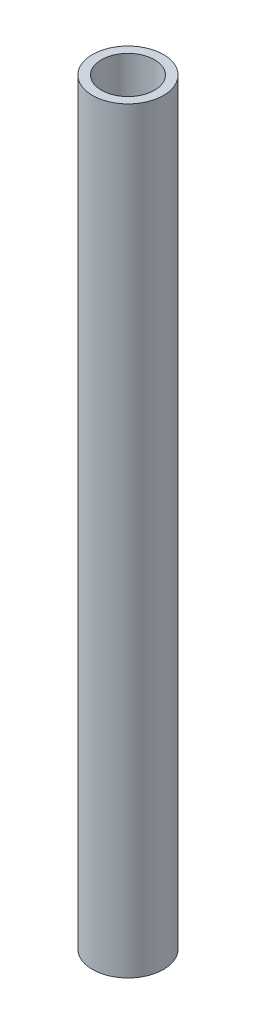
ISO-10303-21;
HEADER;
FILE_DESCRIPTION(('STEP AP214'),'2;1');
FILE_NAME('part.step','',(''),(''),'','','');
FILE_SCHEMA(('AUTOMOTIVE_DESIGN { 1 0 10303 214 1 1 1 1 }'));
ENDSEC;
DATA;
#1=APPLICATION_CONTEXT('core data for automotive mechanical design processes');
#2=APPLICATION_PROTOCOL_DEFINITION('international standard','automotive_design',2000,#1);
#3=PRODUCT_CONTEXT('',#1,'mechanical');
#4=PRODUCT('Part','Part','',(#3));
#5=PRODUCT_RELATED_PRODUCT_CATEGORY('part','',(#4));
#6=PRODUCT_DEFINITION_FORMATION('','',#4);
#7=PRODUCT_DEFINITION_CONTEXT('part definition',#1,'design');
#8=PRODUCT_DEFINITION('design','',#6,#7);
#9=PRODUCT_DEFINITION_SHAPE('','',#8);
#10=(LENGTH_UNIT() NAMED_UNIT(*) SI_UNIT(.MILLI.,.METRE.));
#11=(NAMED_UNIT(*) PLANE_ANGLE_UNIT() SI_UNIT($,.RADIAN.));
#12=(NAMED_UNIT(*) SI_UNIT($,.STERADIAN.) SOLID_ANGLE_UNIT());
#13=UNCERTAINTY_MEASURE_WITH_UNIT(LENGTH_MEASURE(1.E-05),#10,'distance_accuracy_value','');
#14=(GEOMETRIC_REPRESENTATION_CONTEXT(3) GLOBAL_UNCERTAINTY_ASSIGNED_CONTEXT((#13)) GLOBAL_UNIT_ASSIGNED_CONTEXT((#10,
#11,#12)) REPRESENTATION_CONTEXT('',''));
#15=CARTESIAN_POINT('',(0.,0.,0.));
#16=DIRECTION('',(0.,0.,1.));
#17=DIRECTION('',(1.,0.,0.));
#18=AXIS2_PLACEMENT_3D('',#15,#16,#17);
#19=CARTESIAN_POINT('',(0.,203.2,0.));
#20=DIRECTION('',(0.,1.,0.));
#21=DIRECTION('',(0.,0.,1.));
#22=AXIS2_PLACEMENT_3D('',#19,#20,#21);
#23=PLANE('',#22);
#24=CARTESIAN_POINT('',(0.,203.2,0.));
#25=DIRECTION('',(0.,1.,0.));
#26=DIRECTION('',(0.,0.,1.));
#27=AXIS2_PLACEMENT_3D('',#24,#25,#26);
#28=CIRCLE('',#27,9.525);
#29=CARTESIAN_POINT('',(0.,203.2,9.525));
#30=VERTEX_POINT('',#29);
#31=EDGE_CURVE('E10',#30,#30,#28,.T.);
#32=ORIENTED_EDGE('',*,*,#31,.T.);
#33=EDGE_LOOP('',(#32));
#34=FACE_BOUND('',#33,.T.);
#35=CARTESIAN_POINT('',(0.,203.2,0.));
#36=DIRECTION('',(0.,1.,0.));
#37=DIRECTION('',(0.,0.,1.));
#38=AXIS2_PLACEMENT_3D('',#35,#36,#37);
#39=CIRCLE('',#38,7.112);
#40=CARTESIAN_POINT('',(0.,203.2,7.112));
#41=VERTEX_POINT('',#40);
#42=EDGE_CURVE('E42',#41,#41,#39,.T.);
#43=ORIENTED_EDGE('',*,*,#42,.F.);
#44=EDGE_LOOP('',(#43));
#45=FACE_BOUND('',#44,.T.);
#46=ADVANCED_FACE('F31',(#34,#45),#23,.T.);
#47=CARTESIAN_POINT('',(0.,0.,0.));
#48=DIRECTION('',(0.,1.,0.));
#49=DIRECTION('',(0.,0.,1.));
#50=AXIS2_PLACEMENT_3D('',#47,#48,#49);
#51=PLANE('',#50);
#52=CARTESIAN_POINT('',(0.,0.,0.));
#53=DIRECTION('',(0.,1.,0.));
#54=DIRECTION('',(0.,0.,1.));
#55=AXIS2_PLACEMENT_3D('',#52,#53,#54);
#56=CIRCLE('',#55,9.525);
#57=CARTESIAN_POINT('',(0.,0.,9.525));
#58=VERTEX_POINT('',#57);
#59=EDGE_CURVE('E35',#58,#58,#56,.T.);
#60=ORIENTED_EDGE('',*,*,#59,.F.);
#61=EDGE_LOOP('',(#60));
#62=FACE_BOUND('',#61,.T.);
#63=CARTESIAN_POINT('',(0.,0.,0.));
#64=DIRECTION('',(0.,1.,0.));
#65=DIRECTION('',(0.,0.,1.));
#66=AXIS2_PLACEMENT_3D('',#63,#64,#65);
#67=CIRCLE('',#66,7.112);
#68=CARTESIAN_POINT('',(0.,0.,7.112));
#69=VERTEX_POINT('',#68);
#70=EDGE_CURVE('E44',#69,#69,#67,.T.);
#71=ORIENTED_EDGE('',*,*,#70,.T.);
#72=EDGE_LOOP('',(#71));
#73=FACE_BOUND('',#72,.T.);
#74=ADVANCED_FACE('F54',(#62,#73),#51,.F.);
#75=CARTESIAN_POINT('',(0.,203.2,0.));
#76=DIRECTION('',(0.,-1.,0.));
#77=DIRECTION('',(0.,0.,-1.));
#78=AXIS2_PLACEMENT_3D('',#75,#76,#77);
#79=CYLINDRICAL_SURFACE('',#78,9.525);
#80=ORIENTED_EDGE('',*,*,#31,.F.);
#81=EDGE_LOOP('',(#80));
#82=FACE_BOUND('',#81,.T.);
#83=ORIENTED_EDGE('',*,*,#59,.T.);
#84=EDGE_LOOP('',(#83));
#85=FACE_BOUND('',#84,.T.);
#86=ADVANCED_FACE('F33',(#82,#85),#79,.T.);
#87=CARTESIAN_POINT('',(0.,203.2,0.));
#88=DIRECTION('',(0.,-1.,0.));
#89=DIRECTION('',(0.,0.,-1.));
#90=AXIS2_PLACEMENT_3D('',#87,#88,#89);
#91=CYLINDRICAL_SURFACE('',#90,7.112);
#92=ORIENTED_EDGE('',*,*,#42,.T.);
#93=EDGE_LOOP('',(#92));
#94=FACE_BOUND('',#93,.T.);
#95=ORIENTED_EDGE('',*,*,#70,.F.);
#96=EDGE_LOOP('',(#95));
#97=FACE_BOUND('',#96,.T.);
#98=ADVANCED_FACE('F50',(#94,#97),#91,.F.);
#99=CLOSED_SHELL('',(#46,#74,#86,#98));
#100=MANIFOLD_SOLID_BREP('B2',#99);
#101=ADVANCED_BREP_SHAPE_REPRESENTATION('',(#18,#100),#14);
#102=SHAPE_DEFINITION_REPRESENTATION(#9,#101);
ENDSEC;
END-ISO-10303-21;
